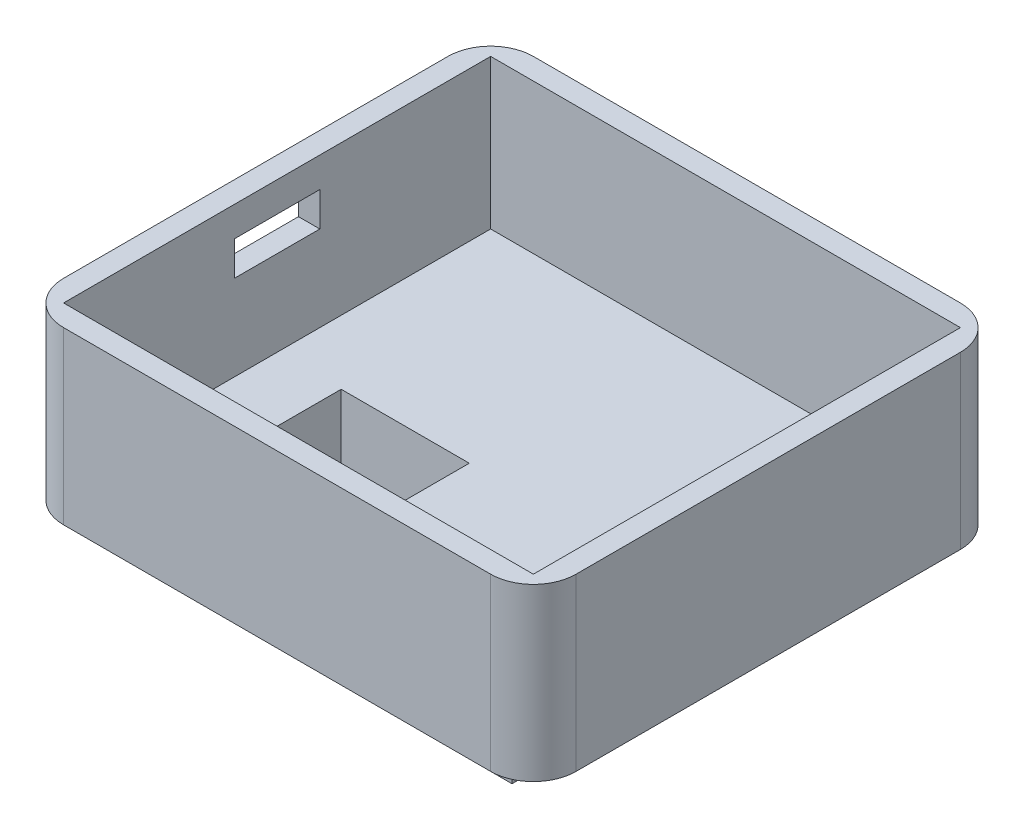
ISO-10303-21;
HEADER;
FILE_DESCRIPTION(('STEP AP214'),'2;1');
FILE_NAME('part.step','',(''),(''),'','','');
FILE_SCHEMA(('AUTOMOTIVE_DESIGN { 1 0 10303 214 1 1 1 1 }'));
ENDSEC;
DATA;
#1=APPLICATION_CONTEXT('core data for automotive mechanical design processes');
#2=APPLICATION_PROTOCOL_DEFINITION('international standard','automotive_design',2000,#1);
#3=PRODUCT_CONTEXT('',#1,'mechanical');
#4=PRODUCT('Part','Part','',(#3));
#5=PRODUCT_RELATED_PRODUCT_CATEGORY('part','',(#4));
#6=PRODUCT_DEFINITION_FORMATION('','',#4);
#7=PRODUCT_DEFINITION_CONTEXT('part definition',#1,'design');
#8=PRODUCT_DEFINITION('design','',#6,#7);
#9=PRODUCT_DEFINITION_SHAPE('','',#8);
#10=(LENGTH_UNIT() NAMED_UNIT(*) SI_UNIT(.MILLI.,.METRE.));
#11=(NAMED_UNIT(*) PLANE_ANGLE_UNIT() SI_UNIT($,.RADIAN.));
#12=(NAMED_UNIT(*) SI_UNIT($,.STERADIAN.) SOLID_ANGLE_UNIT());
#13=UNCERTAINTY_MEASURE_WITH_UNIT(LENGTH_MEASURE(1.E-05),#10,'distance_accuracy_value','');
#14=(GEOMETRIC_REPRESENTATION_CONTEXT(3) GLOBAL_UNCERTAINTY_ASSIGNED_CONTEXT((#13)) GLOBAL_UNIT_ASSIGNED_CONTEXT((#10,
#11,#12)) REPRESENTATION_CONTEXT('',''));
#15=CARTESIAN_POINT('',(0.,0.,0.));
#16=DIRECTION('',(0.,0.,1.));
#17=DIRECTION('',(1.,0.,0.));
#18=AXIS2_PLACEMENT_3D('',#15,#16,#17);
#19=CARTESIAN_POINT('',(0.,0.,0.));
#20=DIRECTION('',(0.,1.,0.));
#21=DIRECTION('',(0.,0.,1.));
#22=AXIS2_PLACEMENT_3D('',#19,#20,#21);
#23=PLANE('',#22);
#24=DIRECTION('',(1.,0.,0.));
#25=VECTOR('',#24,1.);
#26=CARTESIAN_POINT('',(-30.,0.,27.5));
#27=LINE('',#26,#25);
#28=CARTESIAN_POINT('',(-25.,0.,27.5));
#29=VERTEX_POINT('',#28);
#30=CARTESIAN_POINT('',(25.,0.,27.5));
#31=VERTEX_POINT('',#30);
#32=EDGE_CURVE('E401',#29,#31,#27,.T.);
#33=ORIENTED_EDGE('',*,*,#32,.F.);
#34=CARTESIAN_POINT('',(-25.,0.,22.5));
#35=DIRECTION('',(0.,1.,0.));
#36=DIRECTION('',(0.,0.,1.));
#37=AXIS2_PLACEMENT_3D('',#34,#35,#36);
#38=CIRCLE('',#37,5.);
#39=CARTESIAN_POINT('',(-30.,0.,22.5));
#40=VERTEX_POINT('',#39);
#41=EDGE_CURVE('E427',#29,#40,#38,.F.);
#42=ORIENTED_EDGE('',*,*,#41,.T.);
#43=DIRECTION('',(0.,0.,1.));
#44=VECTOR('',#43,1.);
#45=CARTESIAN_POINT('',(-30.,0.,-27.5));
#46=LINE('',#45,#44);
#47=CARTESIAN_POINT('',(-30.,0.,-22.5));
#48=VERTEX_POINT('',#47);
#49=EDGE_CURVE('E370',#48,#40,#46,.T.);
#50=ORIENTED_EDGE('',*,*,#49,.F.);
#51=CARTESIAN_POINT('',(-25.,0.,-22.5));
#52=DIRECTION('',(0.,1.,0.));
#53=DIRECTION('',(0.,0.,1.));
#54=AXIS2_PLACEMENT_3D('',#51,#52,#53);
#55=CIRCLE('',#54,5.);
#56=CARTESIAN_POINT('',(-25.,0.,-27.5));
#57=VERTEX_POINT('',#56);
#58=EDGE_CURVE('E424',#48,#57,#55,.F.);
#59=ORIENTED_EDGE('',*,*,#58,.T.);
#60=DIRECTION('',(-1.,0.,0.));
#61=VECTOR('',#60,1.);
#62=CARTESIAN_POINT('',(-30.,0.,-27.5));
#63=LINE('',#62,#61);
#64=CARTESIAN_POINT('',(25.,0.,-27.5));
#65=VERTEX_POINT('',#64);
#66=EDGE_CURVE('E385',#65,#57,#63,.T.);
#67=ORIENTED_EDGE('',*,*,#66,.F.);
#68=CARTESIAN_POINT('',(25.,0.,-22.5));
#69=DIRECTION('',(0.,1.,0.));
#70=DIRECTION('',(0.,0.,1.));
#71=AXIS2_PLACEMENT_3D('',#68,#69,#70);
#72=CIRCLE('',#71,5.);
#73=CARTESIAN_POINT('',(30.,0.,-22.5));
#74=VERTEX_POINT('',#73);
#75=EDGE_CURVE('E421',#65,#74,#72,.F.);
#76=ORIENTED_EDGE('',*,*,#75,.T.);
#77=DIRECTION('',(0.,0.,-1.));
#78=VECTOR('',#77,1.);
#79=CARTESIAN_POINT('',(30.,0.,-27.5));
#80=LINE('',#79,#78);
#81=CARTESIAN_POINT('',(30.,0.,22.5));
#82=VERTEX_POINT('',#81);
#83=EDGE_CURVE('E405',#82,#74,#80,.T.);
#84=ORIENTED_EDGE('',*,*,#83,.F.);
#85=CARTESIAN_POINT('',(25.,0.,22.5));
#86=DIRECTION('',(0.,1.,0.));
#87=DIRECTION('',(0.,0.,1.));
#88=AXIS2_PLACEMENT_3D('',#85,#86,#87);
#89=CIRCLE('',#88,5.);
#90=EDGE_CURVE('E418',#82,#31,#89,.F.);
#91=ORIENTED_EDGE('',*,*,#90,.T.);
#92=EDGE_LOOP('',(#33,#42,#50,#59,#67,#76,#84,#91));
#93=FACE_BOUND('',#92,.T.);
#94=DIRECTION('',(0.,0.,-1.));
#95=VECTOR('',#94,1.);
#96=CARTESIAN_POINT('',(-22.5,0.,22.5));
#97=LINE('',#96,#95);
#98=CARTESIAN_POINT('',(-22.5,0.,22.5));
#99=VERTEX_POINT('',#98);
#100=CARTESIAN_POINT('',(-22.5,0.,-22.5));
#101=VERTEX_POINT('',#100);
#102=EDGE_CURVE('E290',#99,#101,#97,.T.);
#103=ORIENTED_EDGE('',*,*,#102,.F.);
#104=DIRECTION('',(-1.,0.,0.));
#105=VECTOR('',#104,1.);
#106=CARTESIAN_POINT('',(-22.5,0.,22.5));
#107=LINE('',#106,#105);
#108=CARTESIAN_POINT('',(22.5,0.,22.5));
#109=VERTEX_POINT('',#108);
#110=EDGE_CURVE('E296',#109,#99,#107,.T.);
#111=ORIENTED_EDGE('',*,*,#110,.F.);
#112=DIRECTION('',(0.,0.,1.));
#113=VECTOR('',#112,1.);
#114=CARTESIAN_POINT('',(22.5,0.,22.5));
#115=LINE('',#114,#113);
#116=CARTESIAN_POINT('',(22.5,0.,-22.5));
#117=VERTEX_POINT('',#116);
#118=EDGE_CURVE('E313',#117,#109,#115,.T.);
#119=ORIENTED_EDGE('',*,*,#118,.F.);
#120=DIRECTION('',(1.,0.,0.));
#121=VECTOR('',#120,1.);
#122=CARTESIAN_POINT('',(-22.5,0.,-22.5));
#123=LINE('',#122,#121);
#124=EDGE_CURVE('E309',#101,#117,#123,.T.);
#125=ORIENTED_EDGE('',*,*,#124,.F.);
#126=EDGE_LOOP('',(#103,#111,#119,#125));
#127=FACE_BOUND('',#126,.T.);
#128=ADVANCED_FACE('F38',(#93,#127),#23,.F.);
#129=CARTESIAN_POINT('',(-30.,20.,-27.5));
#130=DIRECTION('',(1.,0.,0.));
#131=DIRECTION('',(0.,0.,-1.));
#132=AXIS2_PLACEMENT_3D('',#129,#130,#131);
#133=PLANE('',#132);
#134=DIRECTION('',(0.,0.,-1.));
#135=VECTOR('',#134,1.);
#136=CARTESIAN_POINT('',(-30.,16.5,5.));
#137=LINE('',#136,#135);
#138=CARTESIAN_POINT('',(-30.,16.5,5.));
#139=VERTEX_POINT('',#138);
#140=CARTESIAN_POINT('',(-30.,16.5,-5.));
#141=VERTEX_POINT('',#140);
#142=EDGE_CURVE('E221',#139,#141,#137,.T.);
#143=ORIENTED_EDGE('',*,*,#142,.F.);
#144=DIRECTION('',(0.,1.,0.));
#145=VECTOR('',#144,1.);
#146=CARTESIAN_POINT('',(-30.,16.5,5.));
#147=LINE('',#146,#145);
#148=CARTESIAN_POINT('',(-30.,12.5,5.));
#149=VERTEX_POINT('',#148);
#150=EDGE_CURVE('E201',#149,#139,#147,.T.);
#151=ORIENTED_EDGE('',*,*,#150,.F.);
#152=DIRECTION('',(0.,0.,1.));
#153=VECTOR('',#152,1.);
#154=CARTESIAN_POINT('',(-30.,12.5,5.));
#155=LINE('',#154,#153);
#156=CARTESIAN_POINT('',(-30.,12.5,-5.));
#157=VERTEX_POINT('',#156);
#158=EDGE_CURVE('E211',#157,#149,#155,.T.);
#159=ORIENTED_EDGE('',*,*,#158,.F.);
#160=DIRECTION('',(0.,-1.,0.));
#161=VECTOR('',#160,1.);
#162=CARTESIAN_POINT('',(-30.,16.5,-5.));
#163=LINE('',#162,#161);
#164=EDGE_CURVE('E54',#141,#157,#163,.T.);
#165=ORIENTED_EDGE('',*,*,#164,.F.);
#166=EDGE_LOOP('',(#143,#151,#159,#165));
#167=FACE_BOUND('',#166,.T.);
#168=ORIENTED_EDGE('',*,*,#49,.T.);
#169=DIRECTION('',(0.,-1.,0.));
#170=VECTOR('',#169,1.);
#171=CARTESIAN_POINT('',(-30.,20.,22.5));
#172=LINE('',#171,#170);
#173=CARTESIAN_POINT('',(-30.,20.,22.5));
#174=VERTEX_POINT('',#173);
#175=EDGE_CURVE('E434',#40,#174,#172,.F.);
#176=ORIENTED_EDGE('',*,*,#175,.T.);
#177=DIRECTION('',(0.,0.,1.));
#178=VECTOR('',#177,1.);
#179=CARTESIAN_POINT('',(-30.,20.,-27.5));
#180=LINE('',#179,#178);
#181=CARTESIAN_POINT('',(-30.,20.,-22.5));
#182=VERTEX_POINT('',#181);
#183=EDGE_CURVE('E380',#182,#174,#180,.T.);
#184=ORIENTED_EDGE('',*,*,#183,.F.);
#185=DIRECTION('',(0.,-1.,0.));
#186=VECTOR('',#185,1.);
#187=CARTESIAN_POINT('',(-30.,20.,-22.5));
#188=LINE('',#187,#186);
#189=EDGE_CURVE('E430',#182,#48,#188,.T.);
#190=ORIENTED_EDGE('',*,*,#189,.T.);
#191=EDGE_LOOP('',(#168,#176,#184,#190));
#192=FACE_BOUND('',#191,.T.);
#193=ADVANCED_FACE('F218',(#167,#192),#133,.F.);
#194=CARTESIAN_POINT('',(-30.,20.,27.5));
#195=DIRECTION('',(0.,0.,-1.));
#196=DIRECTION('',(-1.,0.,0.));
#197=AXIS2_PLACEMENT_3D('',#194,#195,#196);
#198=PLANE('',#197);
#199=DIRECTION('',(1.,0.,0.));
#200=VECTOR('',#199,1.);
#201=CARTESIAN_POINT('',(-30.,20.,27.5));
#202=LINE('',#201,#200);
#203=CARTESIAN_POINT('',(-25.,20.,27.5));
#204=VERTEX_POINT('',#203);
#205=CARTESIAN_POINT('',(25.,20.,27.5));
#206=VERTEX_POINT('',#205);
#207=EDGE_CURVE('E384',#204,#206,#202,.T.);
#208=ORIENTED_EDGE('',*,*,#207,.F.);
#209=DIRECTION('',(0.,-1.,0.));
#210=VECTOR('',#209,1.);
#211=CARTESIAN_POINT('',(-25.,20.,27.5));
#212=LINE('',#211,#210);
#213=EDGE_CURVE('E414',#204,#29,#212,.T.);
#214=ORIENTED_EDGE('',*,*,#213,.T.);
#215=ORIENTED_EDGE('',*,*,#32,.T.);
#216=DIRECTION('',(0.,-1.,0.));
#217=VECTOR('',#216,1.);
#218=CARTESIAN_POINT('',(25.,20.,27.5));
#219=LINE('',#218,#217);
#220=EDGE_CURVE('E397',#31,#206,#219,.F.);
#221=ORIENTED_EDGE('',*,*,#220,.T.);
#222=EDGE_LOOP('',(#208,#214,#215,#221));
#223=FACE_BOUND('',#222,.T.);
#224=ADVANCED_FACE('F492',(#223),#198,.F.);
#225=CARTESIAN_POINT('',(30.,20.,-27.5));
#226=DIRECTION('',(-1.,0.,0.));
#227=DIRECTION('',(0.,0.,1.));
#228=AXIS2_PLACEMENT_3D('',#225,#226,#227);
#229=PLANE('',#228);
#230=ORIENTED_EDGE('',*,*,#83,.T.);
#231=DIRECTION('',(0.,-1.,0.));
#232=VECTOR('',#231,1.);
#233=CARTESIAN_POINT('',(30.,20.,-22.5));
#234=LINE('',#233,#232);
#235=CARTESIAN_POINT('',(30.,20.,-22.5));
#236=VERTEX_POINT('',#235);
#237=EDGE_CURVE('E11',#74,#236,#234,.F.);
#238=ORIENTED_EDGE('',*,*,#237,.T.);
#239=DIRECTION('',(0.,0.,-1.));
#240=VECTOR('',#239,1.);
#241=CARTESIAN_POINT('',(30.,20.,-27.5));
#242=LINE('',#241,#240);
#243=CARTESIAN_POINT('',(30.,20.,22.5));
#244=VERTEX_POINT('',#243);
#245=EDGE_CURVE('E389',#244,#236,#242,.T.);
#246=ORIENTED_EDGE('',*,*,#245,.F.);
#247=DIRECTION('',(0.,-1.,0.));
#248=VECTOR('',#247,1.);
#249=CARTESIAN_POINT('',(30.,20.,22.5));
#250=LINE('',#249,#248);
#251=EDGE_CURVE('E47',#244,#82,#250,.T.);
#252=ORIENTED_EDGE('',*,*,#251,.T.);
#253=EDGE_LOOP('',(#230,#238,#246,#252));
#254=FACE_BOUND('',#253,.T.);
#255=ADVANCED_FACE('F461',(#254),#229,.F.);
#256=CARTESIAN_POINT('',(-30.,20.,-27.5));
#257=DIRECTION('',(0.,0.,1.));
#258=DIRECTION('',(1.,0.,0.));
#259=AXIS2_PLACEMENT_3D('',#256,#257,#258);
#260=PLANE('',#259);
#261=ORIENTED_EDGE('',*,*,#66,.T.);
#262=DIRECTION('',(0.,-1.,0.));
#263=VECTOR('',#262,1.);
#264=CARTESIAN_POINT('',(-25.,20.,-27.5));
#265=LINE('',#264,#263);
#266=CARTESIAN_POINT('',(-25.,20.,-27.5));
#267=VERTEX_POINT('',#266);
#268=EDGE_CURVE('E453',#57,#267,#265,.F.);
#269=ORIENTED_EDGE('',*,*,#268,.T.);
#270=DIRECTION('',(-1.,0.,0.));
#271=VECTOR('',#270,1.);
#272=CARTESIAN_POINT('',(-30.,20.,-27.5));
#273=LINE('',#272,#271);
#274=CARTESIAN_POINT('',(25.,20.,-27.5));
#275=VERTEX_POINT('',#274);
#276=EDGE_CURVE('E393',#275,#267,#273,.T.);
#277=ORIENTED_EDGE('',*,*,#276,.F.);
#278=DIRECTION('',(0.,-1.,0.));
#279=VECTOR('',#278,1.);
#280=CARTESIAN_POINT('',(25.,20.,-27.5));
#281=LINE('',#280,#279);
#282=EDGE_CURVE('E449',#275,#65,#281,.T.);
#283=ORIENTED_EDGE('',*,*,#282,.T.);
#284=EDGE_LOOP('',(#261,#269,#277,#283));
#285=FACE_BOUND('',#284,.T.);
#286=ADVANCED_FACE('F475',(#285),#260,.F.);
#287=CARTESIAN_POINT('',(0.,20.,0.));
#288=DIRECTION('',(0.,1.,0.));
#289=DIRECTION('',(0.,0.,1.));
#290=AXIS2_PLACEMENT_3D('',#287,#288,#289);
#291=PLANE('',#290);
#292=DIRECTION('',(0.,0.,1.));
#293=VECTOR('',#292,1.);
#294=CARTESIAN_POINT('',(-27.5,20.,-25.));
#295=LINE('',#294,#293);
#296=CARTESIAN_POINT('',(-27.5,20.,-25.));
#297=VERTEX_POINT('',#296);
#298=CARTESIAN_POINT('',(-27.5,20.,25.));
#299=VERTEX_POINT('',#298);
#300=EDGE_CURVE('E335',#297,#299,#295,.T.);
#301=ORIENTED_EDGE('',*,*,#300,.F.);
#302=DIRECTION('',(-1.,0.,0.));
#303=VECTOR('',#302,1.);
#304=CARTESIAN_POINT('',(-27.5,20.,-25.));
#305=LINE('',#304,#303);
#306=CARTESIAN_POINT('',(27.5,20.,-25.));
#307=VERTEX_POINT('',#306);
#308=EDGE_CURVE('E341',#307,#297,#305,.T.);
#309=ORIENTED_EDGE('',*,*,#308,.F.);
#310=DIRECTION('',(0.,0.,-1.));
#311=VECTOR('',#310,1.);
#312=CARTESIAN_POINT('',(27.5,20.,-25.));
#313=LINE('',#312,#311);
#314=CARTESIAN_POINT('',(27.5,20.,25.));
#315=VERTEX_POINT('',#314);
#316=EDGE_CURVE('E360',#315,#307,#313,.T.);
#317=ORIENTED_EDGE('',*,*,#316,.F.);
#318=DIRECTION('',(1.,0.,0.));
#319=VECTOR('',#318,1.);
#320=CARTESIAN_POINT('',(-27.5,20.,25.));
#321=LINE('',#320,#319);
#322=EDGE_CURVE('E356',#299,#315,#321,.T.);
#323=ORIENTED_EDGE('',*,*,#322,.F.);
#324=EDGE_LOOP('',(#301,#309,#317,#323));
#325=FACE_BOUND('',#324,.T.);
#326=ORIENTED_EDGE('',*,*,#183,.T.);
#327=CARTESIAN_POINT('',(-25.,20.,22.5));
#328=DIRECTION('',(0.,1.,0.));
#329=DIRECTION('',(0.,0.,1.));
#330=AXIS2_PLACEMENT_3D('',#327,#328,#329);
#331=CIRCLE('',#330,5.);
#332=EDGE_CURVE('E446',#174,#204,#331,.T.);
#333=ORIENTED_EDGE('',*,*,#332,.T.);
#334=ORIENTED_EDGE('',*,*,#207,.T.);
#335=CARTESIAN_POINT('',(25.,20.,22.5));
#336=DIRECTION('',(0.,1.,0.));
#337=DIRECTION('',(0.,0.,1.));
#338=AXIS2_PLACEMENT_3D('',#335,#336,#337);
#339=CIRCLE('',#338,5.);
#340=EDGE_CURVE('E437',#206,#244,#339,.T.);
#341=ORIENTED_EDGE('',*,*,#340,.T.);
#342=ORIENTED_EDGE('',*,*,#245,.T.);
#343=CARTESIAN_POINT('',(25.,20.,-22.5));
#344=DIRECTION('',(0.,1.,0.));
#345=DIRECTION('',(0.,0.,1.));
#346=AXIS2_PLACEMENT_3D('',#343,#344,#345);
#347=CIRCLE('',#346,5.);
#348=EDGE_CURVE('E440',#236,#275,#347,.T.);
#349=ORIENTED_EDGE('',*,*,#348,.T.);
#350=ORIENTED_EDGE('',*,*,#276,.T.);
#351=CARTESIAN_POINT('',(-25.,20.,-22.5));
#352=DIRECTION('',(0.,1.,0.));
#353=DIRECTION('',(0.,0.,1.));
#354=AXIS2_PLACEMENT_3D('',#351,#352,#353);
#355=CIRCLE('',#354,5.);
#356=EDGE_CURVE('E443',#267,#182,#355,.T.);
#357=ORIENTED_EDGE('',*,*,#356,.T.);
#358=EDGE_LOOP('',(#326,#333,#334,#341,#342,#349,#350,#357));
#359=FACE_BOUND('',#358,.T.);
#360=ADVANCED_FACE('F479',(#325,#359),#291,.T.);
#361=CARTESIAN_POINT('',(-27.5,2.5,-25.));
#362=DIRECTION('',(-1.,0.,0.));
#363=DIRECTION('',(0.,0.,1.));
#364=AXIS2_PLACEMENT_3D('',#361,#362,#363);
#365=PLANE('',#364);
#366=DIRECTION('',(0.,0.,-1.));
#367=VECTOR('',#366,1.);
#368=CARTESIAN_POINT('',(-27.5,12.5,5.));
#369=LINE('',#368,#367);
#370=CARTESIAN_POINT('',(-27.5,12.5,5.));
#371=VERTEX_POINT('',#370);
#372=CARTESIAN_POINT('',(-27.5,12.5,-5.));
#373=VERTEX_POINT('',#372);
#374=EDGE_CURVE('E226',#371,#373,#369,.T.);
#375=ORIENTED_EDGE('',*,*,#374,.F.);
#376=DIRECTION('',(0.,-1.,0.));
#377=VECTOR('',#376,1.);
#378=CARTESIAN_POINT('',(-27.5,16.5,5.));
#379=LINE('',#378,#377);
#380=CARTESIAN_POINT('',(-27.5,16.5,5.));
#381=VERTEX_POINT('',#380);
#382=EDGE_CURVE('E62',#381,#371,#379,.T.);
#383=ORIENTED_EDGE('',*,*,#382,.F.);
#384=DIRECTION('',(0.,0.,1.));
#385=VECTOR('',#384,1.);
#386=CARTESIAN_POINT('',(-27.5,16.5,5.));
#387=LINE('',#386,#385);
#388=CARTESIAN_POINT('',(-27.5,16.5,-5.));
#389=VERTEX_POINT('',#388);
#390=EDGE_CURVE('E208',#389,#381,#387,.T.);
#391=ORIENTED_EDGE('',*,*,#390,.F.);
#392=DIRECTION('',(0.,1.,0.));
#393=VECTOR('',#392,1.);
#394=CARTESIAN_POINT('',(-27.5,16.5,-5.));
#395=LINE('',#394,#393);
#396=EDGE_CURVE('E233',#373,#389,#395,.T.);
#397=ORIENTED_EDGE('',*,*,#396,.F.);
#398=EDGE_LOOP('',(#375,#383,#391,#397));
#399=FACE_BOUND('',#398,.T.);
#400=ORIENTED_EDGE('',*,*,#300,.T.);
#401=DIRECTION('',(0.,1.,0.));
#402=VECTOR('',#401,1.);
#403=CARTESIAN_POINT('',(-27.5,2.5,25.));
#404=LINE('',#403,#402);
#405=CARTESIAN_POINT('',(-27.5,2.5,25.));
#406=VERTEX_POINT('',#405);
#407=EDGE_CURVE('E353',#406,#299,#404,.T.);
#408=ORIENTED_EDGE('',*,*,#407,.F.);
#409=DIRECTION('',(0.,0.,1.));
#410=VECTOR('',#409,1.);
#411=CARTESIAN_POINT('',(-27.5,2.5,-25.));
#412=LINE('',#411,#410);
#413=CARTESIAN_POINT('',(-27.5,2.5,-25.));
#414=VERTEX_POINT('',#413);
#415=EDGE_CURVE('E336',#414,#406,#412,.T.);
#416=ORIENTED_EDGE('',*,*,#415,.F.);
#417=DIRECTION('',(0.,1.,0.));
#418=VECTOR('',#417,1.);
#419=CARTESIAN_POINT('',(-27.5,2.5,-25.));
#420=LINE('',#419,#418);
#421=EDGE_CURVE('E367',#414,#297,#420,.T.);
#422=ORIENTED_EDGE('',*,*,#421,.T.);
#423=EDGE_LOOP('',(#400,#408,#416,#422));
#424=FACE_BOUND('',#423,.T.);
#425=ADVANCED_FACE('F650',(#399,#424),#365,.F.);
#426=CARTESIAN_POINT('',(-27.5,2.5,-25.));
#427=DIRECTION('',(0.,0.,-1.));
#428=DIRECTION('',(-1.,0.,0.));
#429=AXIS2_PLACEMENT_3D('',#426,#427,#428);
#430=PLANE('',#429);
#431=ORIENTED_EDGE('',*,*,#308,.T.);
#432=ORIENTED_EDGE('',*,*,#421,.F.);
#433=DIRECTION('',(-1.,0.,0.));
#434=VECTOR('',#433,1.);
#435=CARTESIAN_POINT('',(-27.5,2.5,-25.));
#436=LINE('',#435,#434);
#437=CARTESIAN_POINT('',(27.5,2.5,-25.));
#438=VERTEX_POINT('',#437);
#439=EDGE_CURVE('E349',#438,#414,#436,.T.);
#440=ORIENTED_EDGE('',*,*,#439,.F.);
#441=DIRECTION('',(0.,1.,0.));
#442=VECTOR('',#441,1.);
#443=CARTESIAN_POINT('',(27.5,2.5,-25.));
#444=LINE('',#443,#442);
#445=EDGE_CURVE('E371',#438,#307,#444,.T.);
#446=ORIENTED_EDGE('',*,*,#445,.T.);
#447=EDGE_LOOP('',(#431,#432,#440,#446));
#448=FACE_BOUND('',#447,.T.);
#449=ADVANCED_FACE('F655',(#448),#430,.F.);
#450=CARTESIAN_POINT('',(27.5,2.5,-25.));
#451=DIRECTION('',(1.,0.,0.));
#452=DIRECTION('',(0.,0.,-1.));
#453=AXIS2_PLACEMENT_3D('',#450,#451,#452);
#454=PLANE('',#453);
#455=ORIENTED_EDGE('',*,*,#316,.T.);
#456=ORIENTED_EDGE('',*,*,#445,.F.);
#457=DIRECTION('',(0.,0.,-1.));
#458=VECTOR('',#457,1.);
#459=CARTESIAN_POINT('',(27.5,2.5,-25.));
#460=LINE('',#459,#458);
#461=CARTESIAN_POINT('',(27.5,2.5,25.));
#462=VERTEX_POINT('',#461);
#463=EDGE_CURVE('E345',#462,#438,#460,.T.);
#464=ORIENTED_EDGE('',*,*,#463,.F.);
#465=DIRECTION('',(0.,1.,0.));
#466=VECTOR('',#465,1.);
#467=CARTESIAN_POINT('',(27.5,2.5,25.));
#468=LINE('',#467,#466);
#469=EDGE_CURVE('E374',#462,#315,#468,.T.);
#470=ORIENTED_EDGE('',*,*,#469,.T.);
#471=EDGE_LOOP('',(#455,#456,#464,#470));
#472=FACE_BOUND('',#471,.T.);
#473=ADVANCED_FACE('F698',(#472),#454,.F.);
#474=CARTESIAN_POINT('',(-27.5,2.5,25.));
#475=DIRECTION('',(0.,0.,1.));
#476=DIRECTION('',(1.,0.,0.));
#477=AXIS2_PLACEMENT_3D('',#474,#475,#476);
#478=PLANE('',#477);
#479=ORIENTED_EDGE('',*,*,#322,.T.);
#480=ORIENTED_EDGE('',*,*,#469,.F.);
#481=DIRECTION('',(1.,0.,0.));
#482=VECTOR('',#481,1.);
#483=CARTESIAN_POINT('',(-27.5,2.5,25.));
#484=LINE('',#483,#482);
#485=EDGE_CURVE('E340',#406,#462,#484,.T.);
#486=ORIENTED_EDGE('',*,*,#485,.F.);
#487=ORIENTED_EDGE('',*,*,#407,.T.);
#488=EDGE_LOOP('',(#479,#480,#486,#487));
#489=FACE_BOUND('',#488,.T.);
#490=ADVANCED_FACE('F585',(#489),#478,.F.);
#491=CARTESIAN_POINT('',(0.,2.5,0.));
#492=DIRECTION('',(0.,1.,0.));
#493=DIRECTION('',(0.,0.,1.));
#494=AXIS2_PLACEMENT_3D('',#491,#492,#493);
#495=PLANE('',#494);
#496=DIRECTION('',(0.,0.,-1.));
#497=VECTOR('',#496,1.);
#498=CARTESIAN_POINT('',(-20.,2.5,20.));
#499=LINE('',#498,#497);
#500=CARTESIAN_POINT('',(-20.,2.5,20.));
#501=VERTEX_POINT('',#500);
#502=CARTESIAN_POINT('',(-20.,2.5,0.));
#503=VERTEX_POINT('',#502);
#504=EDGE_CURVE('E254',#501,#503,#499,.T.);
#505=ORIENTED_EDGE('',*,*,#504,.T.);
#506=DIRECTION('',(1.,0.,0.));
#507=VECTOR('',#506,1.);
#508=CARTESIAN_POINT('',(-20.,2.5,0.));
#509=LINE('',#508,#507);
#510=CARTESIAN_POINT('',(-5.,2.5,0.));
#511=VERTEX_POINT('',#510);
#512=EDGE_CURVE('E277',#503,#511,#509,.T.);
#513=ORIENTED_EDGE('',*,*,#512,.T.);
#514=DIRECTION('',(0.,0.,1.));
#515=VECTOR('',#514,1.);
#516=CARTESIAN_POINT('',(-5.,2.5,20.));
#517=LINE('',#516,#515);
#518=CARTESIAN_POINT('',(-5.,2.5,20.));
#519=VERTEX_POINT('',#518);
#520=EDGE_CURVE('E215',#511,#519,#517,.T.);
#521=ORIENTED_EDGE('',*,*,#520,.T.);
#522=DIRECTION('',(-1.,0.,0.));
#523=VECTOR('',#522,1.);
#524=CARTESIAN_POINT('',(-20.,2.5,20.));
#525=LINE('',#524,#523);
#526=EDGE_CURVE('E250',#519,#501,#525,.T.);
#527=ORIENTED_EDGE('',*,*,#526,.T.);
#528=EDGE_LOOP('',(#505,#513,#521,#527));
#529=FACE_BOUND('',#528,.T.);
#530=ORIENTED_EDGE('',*,*,#415,.T.);
#531=ORIENTED_EDGE('',*,*,#485,.T.);
#532=ORIENTED_EDGE('',*,*,#463,.T.);
#533=ORIENTED_EDGE('',*,*,#439,.T.);
#534=EDGE_LOOP('',(#530,#531,#532,#533));
#535=FACE_BOUND('',#534,.T.);
#536=ADVANCED_FACE('F520',(#529,#535),#495,.T.);
#537=CARTESIAN_POINT('',(-25.,20.,22.5));
#538=DIRECTION('',(0.,-1.,0.));
#539=DIRECTION('',(0.,0.,-1.));
#540=AXIS2_PLACEMENT_3D('',#537,#538,#539);
#541=CYLINDRICAL_SURFACE('',#540,5.);
#542=ORIENTED_EDGE('',*,*,#332,.F.);
#543=ORIENTED_EDGE('',*,*,#175,.F.);
#544=ORIENTED_EDGE('',*,*,#41,.F.);
#545=ORIENTED_EDGE('',*,*,#213,.F.);
#546=EDGE_LOOP('',(#542,#543,#544,#545));
#547=FACE_BOUND('',#546,.T.);
#548=ADVANCED_FACE('F489',(#547),#541,.T.);
#549=CARTESIAN_POINT('',(-25.,20.,-22.5));
#550=DIRECTION('',(0.,-1.,0.));
#551=DIRECTION('',(0.,0.,-1.));
#552=AXIS2_PLACEMENT_3D('',#549,#550,#551);
#553=CYLINDRICAL_SURFACE('',#552,5.);
#554=ORIENTED_EDGE('',*,*,#356,.F.);
#555=ORIENTED_EDGE('',*,*,#268,.F.);
#556=ORIENTED_EDGE('',*,*,#58,.F.);
#557=ORIENTED_EDGE('',*,*,#189,.F.);
#558=EDGE_LOOP('',(#554,#555,#556,#557));
#559=FACE_BOUND('',#558,.T.);
#560=ADVANCED_FACE('F483',(#559),#553,.T.);
#561=CARTESIAN_POINT('',(25.,20.,-22.5));
#562=DIRECTION('',(0.,-1.,0.));
#563=DIRECTION('',(0.,0.,-1.));
#564=AXIS2_PLACEMENT_3D('',#561,#562,#563);
#565=CYLINDRICAL_SURFACE('',#564,5.);
#566=ORIENTED_EDGE('',*,*,#348,.F.);
#567=ORIENTED_EDGE('',*,*,#237,.F.);
#568=ORIENTED_EDGE('',*,*,#75,.F.);
#569=ORIENTED_EDGE('',*,*,#282,.F.);
#570=EDGE_LOOP('',(#566,#567,#568,#569));
#571=FACE_BOUND('',#570,.T.);
#572=ADVANCED_FACE('F472',(#571),#565,.T.);
#573=CARTESIAN_POINT('',(25.,20.,22.5));
#574=DIRECTION('',(0.,-1.,0.));
#575=DIRECTION('',(0.,0.,-1.));
#576=AXIS2_PLACEMENT_3D('',#573,#574,#575);
#577=CYLINDRICAL_SURFACE('',#576,5.);
#578=ORIENTED_EDGE('',*,*,#340,.F.);
#579=ORIENTED_EDGE('',*,*,#220,.F.);
#580=ORIENTED_EDGE('',*,*,#90,.F.);
#581=ORIENTED_EDGE('',*,*,#251,.F.);
#582=EDGE_LOOP('',(#578,#579,#580,#581));
#583=FACE_BOUND('',#582,.T.);
#584=ADVANCED_FACE('F40',(#583),#577,.T.);
#585=CARTESIAN_POINT('',(-22.5,-5.,22.5));
#586=DIRECTION('',(1.,0.,0.));
#587=DIRECTION('',(0.,0.,-1.));
#588=AXIS2_PLACEMENT_3D('',#585,#586,#587);
#589=PLANE('',#588);
#590=ORIENTED_EDGE('',*,*,#102,.T.);
#591=DIRECTION('',(0.,1.,0.));
#592=VECTOR('',#591,1.);
#593=CARTESIAN_POINT('',(-22.5,-5.,-22.5));
#594=LINE('',#593,#592);
#595=CARTESIAN_POINT('',(-22.5,-5.,-22.5));
#596=VERTEX_POINT('',#595);
#597=EDGE_CURVE('E331',#596,#101,#594,.T.);
#598=ORIENTED_EDGE('',*,*,#597,.F.);
#599=DIRECTION('',(0.,0.,-1.));
#600=VECTOR('',#599,1.);
#601=CARTESIAN_POINT('',(-22.5,-5.,22.5));
#602=LINE('',#601,#600);
#603=CARTESIAN_POINT('',(-22.5,-5.,22.5));
#604=VERTEX_POINT('',#603);
#605=EDGE_CURVE('E291',#604,#596,#602,.T.);
#606=ORIENTED_EDGE('',*,*,#605,.F.);
#607=DIRECTION('',(0.,1.,0.));
#608=VECTOR('',#607,1.);
#609=CARTESIAN_POINT('',(-22.5,-5.,22.5));
#610=LINE('',#609,#608);
#611=EDGE_CURVE('E305',#604,#99,#610,.T.);
#612=ORIENTED_EDGE('',*,*,#611,.T.);
#613=EDGE_LOOP('',(#590,#598,#606,#612));
#614=FACE_BOUND('',#613,.T.);
#615=ADVANCED_FACE('F495',(#614),#589,.F.);
#616=CARTESIAN_POINT('',(-22.5,-5.,-22.5));
#617=DIRECTION('',(0.,0.,1.));
#618=DIRECTION('',(1.,0.,0.));
#619=AXIS2_PLACEMENT_3D('',#616,#617,#618);
#620=PLANE('',#619);
#621=ORIENTED_EDGE('',*,*,#124,.T.);
#622=DIRECTION('',(0.,1.,0.));
#623=VECTOR('',#622,1.);
#624=CARTESIAN_POINT('',(22.5,-5.,-22.5));
#625=LINE('',#624,#623);
#626=CARTESIAN_POINT('',(22.5,-5.,-22.5));
#627=VERTEX_POINT('',#626);
#628=EDGE_CURVE('E327',#627,#117,#625,.T.);
#629=ORIENTED_EDGE('',*,*,#628,.F.);
#630=DIRECTION('',(1.,0.,0.));
#631=VECTOR('',#630,1.);
#632=CARTESIAN_POINT('',(-22.5,-5.,-22.5));
#633=LINE('',#632,#631);
#634=EDGE_CURVE('E295',#596,#627,#633,.T.);
#635=ORIENTED_EDGE('',*,*,#634,.F.);
#636=ORIENTED_EDGE('',*,*,#597,.T.);
#637=EDGE_LOOP('',(#621,#629,#635,#636));
#638=FACE_BOUND('',#637,.T.);
#639=ADVANCED_FACE('F500',(#638),#620,.F.);
#640=CARTESIAN_POINT('',(22.5,-5.,22.5));
#641=DIRECTION('',(-1.,0.,0.));
#642=DIRECTION('',(0.,0.,1.));
#643=AXIS2_PLACEMENT_3D('',#640,#641,#642);
#644=PLANE('',#643);
#645=ORIENTED_EDGE('',*,*,#118,.T.);
#646=DIRECTION('',(0.,1.,0.));
#647=VECTOR('',#646,1.);
#648=CARTESIAN_POINT('',(22.5,-5.,22.5));
#649=LINE('',#648,#647);
#650=CARTESIAN_POINT('',(22.5,-5.,22.5));
#651=VERTEX_POINT('',#650);
#652=EDGE_CURVE('E323',#651,#109,#649,.T.);
#653=ORIENTED_EDGE('',*,*,#652,.F.);
#654=DIRECTION('',(0.,0.,1.));
#655=VECTOR('',#654,1.);
#656=CARTESIAN_POINT('',(22.5,-5.,22.5));
#657=LINE('',#656,#655);
#658=EDGE_CURVE('E299',#627,#651,#657,.T.);
#659=ORIENTED_EDGE('',*,*,#658,.F.);
#660=ORIENTED_EDGE('',*,*,#628,.T.);
#661=EDGE_LOOP('',(#645,#653,#659,#660));
#662=FACE_BOUND('',#661,.T.);
#663=ADVANCED_FACE('F554',(#662),#644,.F.);
#664=CARTESIAN_POINT('',(-22.5,-5.,22.5));
#665=DIRECTION('',(0.,0.,-1.));
#666=DIRECTION('',(-1.,0.,0.));
#667=AXIS2_PLACEMENT_3D('',#664,#665,#666);
#668=PLANE('',#667);
#669=ORIENTED_EDGE('',*,*,#110,.T.);
#670=ORIENTED_EDGE('',*,*,#611,.F.);
#671=DIRECTION('',(-1.,0.,0.));
#672=VECTOR('',#671,1.);
#673=CARTESIAN_POINT('',(-22.5,-5.,22.5));
#674=LINE('',#673,#672);
#675=EDGE_CURVE('E302',#651,#604,#674,.T.);
#676=ORIENTED_EDGE('',*,*,#675,.F.);
#677=ORIENTED_EDGE('',*,*,#652,.T.);
#678=EDGE_LOOP('',(#669,#670,#676,#677));
#679=FACE_BOUND('',#678,.T.);
#680=ADVANCED_FACE('F564',(#679),#668,.F.);
#681=CARTESIAN_POINT('',(0.,-5.,0.));
#682=DIRECTION('',(0.,-1.,0.));
#683=DIRECTION('',(0.,0.,-1.));
#684=AXIS2_PLACEMENT_3D('',#681,#682,#683);
#685=PLANE('',#684);
#686=DIRECTION('',(0.,0.,-1.));
#687=VECTOR('',#686,1.);
#688=CARTESIAN_POINT('',(-20.,-5.,20.));
#689=LINE('',#688,#687);
#690=CARTESIAN_POINT('',(-20.,-5.,20.));
#691=VERTEX_POINT('',#690);
#692=CARTESIAN_POINT('',(-20.,-5.,0.));
#693=VERTEX_POINT('',#692);
#694=EDGE_CURVE('E258',#691,#693,#689,.T.);
#695=ORIENTED_EDGE('',*,*,#694,.F.);
#696=DIRECTION('',(-1.,0.,0.));
#697=VECTOR('',#696,1.);
#698=CARTESIAN_POINT('',(-20.,-5.,20.));
#699=LINE('',#698,#697);
#700=CARTESIAN_POINT('',(-5.,-5.,20.));
#701=VERTEX_POINT('',#700);
#702=EDGE_CURVE('E269',#701,#691,#699,.T.);
#703=ORIENTED_EDGE('',*,*,#702,.F.);
#704=DIRECTION('',(0.,0.,1.));
#705=VECTOR('',#704,1.);
#706=CARTESIAN_POINT('',(-5.,-5.,20.));
#707=LINE('',#706,#705);
#708=CARTESIAN_POINT('',(-5.,-5.,0.));
#709=VERTEX_POINT('',#708);
#710=EDGE_CURVE('E265',#709,#701,#707,.T.);
#711=ORIENTED_EDGE('',*,*,#710,.F.);
#712=DIRECTION('',(1.,0.,0.));
#713=VECTOR('',#712,1.);
#714=CARTESIAN_POINT('',(-20.,-5.,0.));
#715=LINE('',#714,#713);
#716=EDGE_CURVE('E261',#693,#709,#715,.T.);
#717=ORIENTED_EDGE('',*,*,#716,.F.);
#718=EDGE_LOOP('',(#695,#703,#711,#717));
#719=FACE_BOUND('',#718,.T.);
#720=ORIENTED_EDGE('',*,*,#605,.T.);
#721=ORIENTED_EDGE('',*,*,#634,.T.);
#722=ORIENTED_EDGE('',*,*,#658,.T.);
#723=ORIENTED_EDGE('',*,*,#675,.T.);
#724=EDGE_LOOP('',(#720,#721,#722,#723));
#725=FACE_BOUND('',#724,.T.);
#726=ADVANCED_FACE('F574',(#719,#725),#685,.T.);
#727=CARTESIAN_POINT('',(-20.,20.001,20.));
#728=DIRECTION('',(-1.,0.,0.));
#729=DIRECTION('',(0.,0.,1.));
#730=AXIS2_PLACEMENT_3D('',#727,#728,#729);
#731=PLANE('',#730);
#732=DIRECTION('',(0.,-1.,0.));
#733=VECTOR('',#732,1.);
#734=CARTESIAN_POINT('',(-20.,20.001,20.));
#735=LINE('',#734,#733);
#736=EDGE_CURVE('E274',#501,#691,#735,.T.);
#737=ORIENTED_EDGE('',*,*,#736,.T.);
#738=ORIENTED_EDGE('',*,*,#694,.T.);
#739=DIRECTION('',(0.,-1.,0.));
#740=VECTOR('',#739,1.);
#741=CARTESIAN_POINT('',(-20.,20.001,0.));
#742=LINE('',#741,#740);
#743=EDGE_CURVE('E273',#503,#693,#742,.T.);
#744=ORIENTED_EDGE('',*,*,#743,.F.);
#745=ORIENTED_EDGE('',*,*,#504,.F.);
#746=EDGE_LOOP('',(#737,#738,#744,#745));
#747=FACE_BOUND('',#746,.T.);
#748=ADVANCED_FACE('F596',(#747),#731,.F.);
#749=CARTESIAN_POINT('',(-20.,20.001,20.));
#750=DIRECTION('',(0.,0.,1.));
#751=DIRECTION('',(1.,0.,0.));
#752=AXIS2_PLACEMENT_3D('',#749,#750,#751);
#753=PLANE('',#752);
#754=DIRECTION('',(0.,-1.,0.));
#755=VECTOR('',#754,1.);
#756=CARTESIAN_POINT('',(-5.,20.001,20.));
#757=LINE('',#756,#755);
#758=EDGE_CURVE('E278',#519,#701,#757,.T.);
#759=ORIENTED_EDGE('',*,*,#758,.T.);
#760=ORIENTED_EDGE('',*,*,#702,.T.);
#761=ORIENTED_EDGE('',*,*,#736,.F.);
#762=ORIENTED_EDGE('',*,*,#526,.F.);
#763=EDGE_LOOP('',(#759,#760,#761,#762));
#764=FACE_BOUND('',#763,.T.);
#765=ADVANCED_FACE('F606',(#764),#753,.F.);
#766=CARTESIAN_POINT('',(-5.,20.001,20.));
#767=DIRECTION('',(1.,0.,0.));
#768=DIRECTION('',(0.,0.,-1.));
#769=AXIS2_PLACEMENT_3D('',#766,#767,#768);
#770=PLANE('',#769);
#771=DIRECTION('',(0.,-1.,0.));
#772=VECTOR('',#771,1.);
#773=CARTESIAN_POINT('',(-5.,20.001,0.));
#774=LINE('',#773,#772);
#775=EDGE_CURVE('E281',#511,#709,#774,.T.);
#776=ORIENTED_EDGE('',*,*,#775,.T.);
#777=ORIENTED_EDGE('',*,*,#710,.T.);
#778=ORIENTED_EDGE('',*,*,#758,.F.);
#779=ORIENTED_EDGE('',*,*,#520,.F.);
#780=EDGE_LOOP('',(#776,#777,#778,#779));
#781=FACE_BOUND('',#780,.T.);
#782=ADVANCED_FACE('F616',(#781),#770,.F.);
#783=CARTESIAN_POINT('',(-20.,20.001,0.));
#784=DIRECTION('',(0.,0.,-1.));
#785=DIRECTION('',(-1.,0.,0.));
#786=AXIS2_PLACEMENT_3D('',#783,#784,#785);
#787=PLANE('',#786);
#788=ORIENTED_EDGE('',*,*,#743,.T.);
#789=ORIENTED_EDGE('',*,*,#716,.T.);
#790=ORIENTED_EDGE('',*,*,#775,.F.);
#791=ORIENTED_EDGE('',*,*,#512,.F.);
#792=EDGE_LOOP('',(#788,#789,#790,#791));
#793=FACE_BOUND('',#792,.T.);
#794=ADVANCED_FACE('F626',(#793),#787,.F.);
#795=CARTESIAN_POINT('',(-30.001,16.5,5.));
#796=DIRECTION('',(0.,0.,1.));
#797=DIRECTION('',(0.,-1.,0.));
#798=AXIS2_PLACEMENT_3D('',#795,#796,#797);
#799=PLANE('',#798);
#800=ORIENTED_EDGE('',*,*,#150,.T.);
#801=DIRECTION('',(1.,0.,0.));
#802=VECTOR('',#801,1.);
#803=CARTESIAN_POINT('',(-30.001,16.5,5.));
#804=LINE('',#803,#802);
#805=EDGE_CURVE('E216',#139,#381,#804,.T.);
#806=ORIENTED_EDGE('',*,*,#805,.T.);
#807=ORIENTED_EDGE('',*,*,#382,.T.);
#808=DIRECTION('',(1.,0.,0.));
#809=VECTOR('',#808,1.);
#810=CARTESIAN_POINT('',(-30.001,12.5,5.));
#811=LINE('',#810,#809);
#812=EDGE_CURVE('E197',#149,#371,#811,.T.);
#813=ORIENTED_EDGE('',*,*,#812,.F.);
#814=EDGE_LOOP('',(#800,#806,#807,#813));
#815=FACE_BOUND('',#814,.T.);
#816=ADVANCED_FACE('F199',(#815),#799,.F.);
#817=CARTESIAN_POINT('',(-30.001,16.5,5.));
#818=DIRECTION('',(0.,1.,0.));
#819=DIRECTION('',(0.,0.,1.));
#820=AXIS2_PLACEMENT_3D('',#817,#818,#819);
#821=PLANE('',#820);
#822=ORIENTED_EDGE('',*,*,#142,.T.);
#823=DIRECTION('',(1.,0.,0.));
#824=VECTOR('',#823,1.);
#825=CARTESIAN_POINT('',(-30.001,16.5,-5.));
#826=LINE('',#825,#824);
#827=EDGE_CURVE('E242',#141,#389,#826,.T.);
#828=ORIENTED_EDGE('',*,*,#827,.T.);
#829=ORIENTED_EDGE('',*,*,#390,.T.);
#830=ORIENTED_EDGE('',*,*,#805,.F.);
#831=EDGE_LOOP('',(#822,#828,#829,#830));
#832=FACE_BOUND('',#831,.T.);
#833=ADVANCED_FACE('F666',(#832),#821,.F.);
#834=CARTESIAN_POINT('',(-30.001,16.5,-5.));
#835=DIRECTION('',(0.,0.,-1.));
#836=DIRECTION('',(-1.,0.,0.));
#837=AXIS2_PLACEMENT_3D('',#834,#835,#836);
#838=PLANE('',#837);
#839=ORIENTED_EDGE('',*,*,#164,.T.);
#840=DIRECTION('',(1.,0.,0.));
#841=VECTOR('',#840,1.);
#842=CARTESIAN_POINT('',(-30.001,12.5,-5.));
#843=LINE('',#842,#841);
#844=EDGE_CURVE('E207',#157,#373,#843,.T.);
#845=ORIENTED_EDGE('',*,*,#844,.T.);
#846=ORIENTED_EDGE('',*,*,#396,.T.);
#847=ORIENTED_EDGE('',*,*,#827,.F.);
#848=EDGE_LOOP('',(#839,#845,#846,#847));
#849=FACE_BOUND('',#848,.T.);
#850=ADVANCED_FACE('F675',(#849),#838,.F.);
#851=CARTESIAN_POINT('',(-30.001,12.5,5.));
#852=DIRECTION('',(0.,-1.,0.));
#853=DIRECTION('',(0.,0.,-1.));
#854=AXIS2_PLACEMENT_3D('',#851,#852,#853);
#855=PLANE('',#854);
#856=ORIENTED_EDGE('',*,*,#158,.T.);
#857=ORIENTED_EDGE('',*,*,#812,.T.);
#858=ORIENTED_EDGE('',*,*,#374,.T.);
#859=ORIENTED_EDGE('',*,*,#844,.F.);
#860=EDGE_LOOP('',(#856,#857,#858,#859));
#861=FACE_BOUND('',#860,.T.);
#862=ADVANCED_FACE('F212',(#861),#855,.F.);
#863=CLOSED_SHELL('',(#128,#193,#224,#255,#286,#360,#425,#449,#473,#490,#536,#548,#560,#572,
#584,#615,#639,#663,#680,#726,#748,#765,#782,#794,#816,#833,#850,#862));
#864=MANIFOLD_SOLID_BREP('B2',#863);
#865=ADVANCED_BREP_SHAPE_REPRESENTATION('',(#18,#864),#14);
#866=SHAPE_DEFINITION_REPRESENTATION(#9,#865);
ENDSEC;
END-ISO-10303-21;
